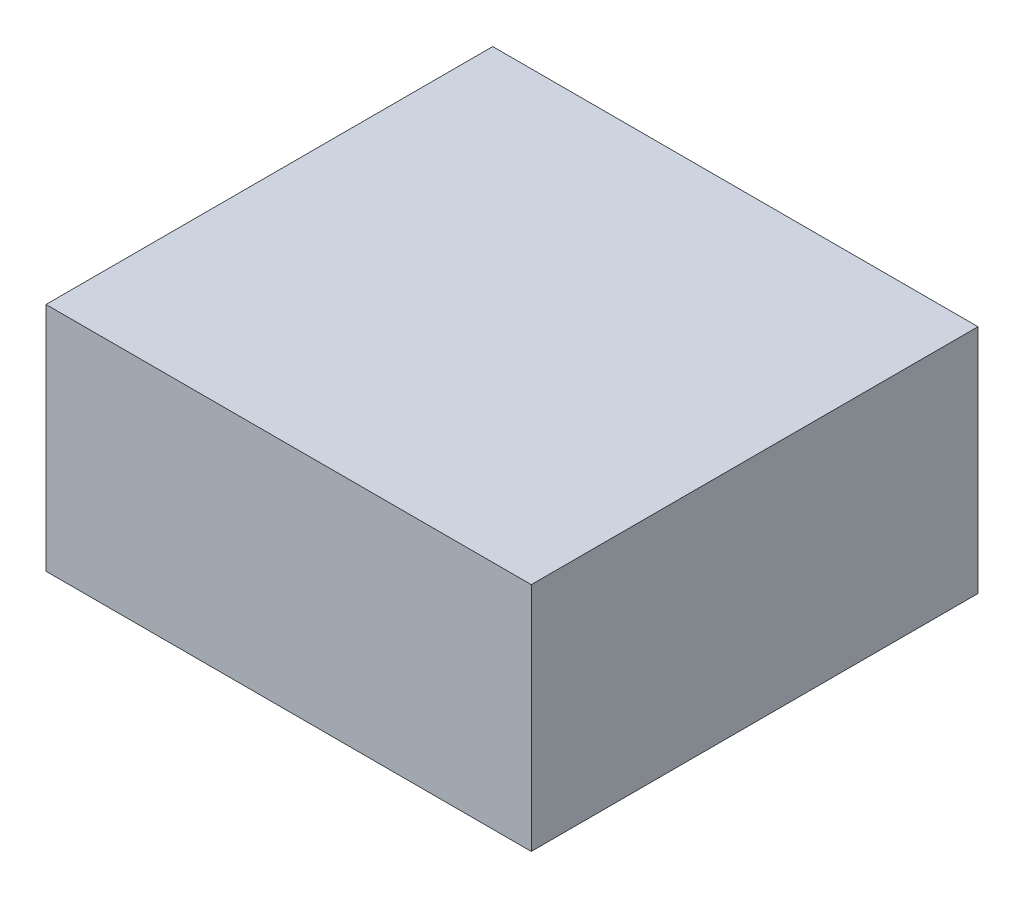
ISO-10303-21;
HEADER;
FILE_DESCRIPTION(('STEP AP214'),'2;1');
FILE_NAME('part.step','',(''),(''),'','','');
FILE_SCHEMA(('AUTOMOTIVE_DESIGN { 1 0 10303 214 1 1 1 1 }'));
ENDSEC;
DATA;
#1=APPLICATION_CONTEXT('core data for automotive mechanical design processes');
#2=APPLICATION_PROTOCOL_DEFINITION('international standard','automotive_design',2000,#1);
#3=PRODUCT_CONTEXT('',#1,'mechanical');
#4=PRODUCT('Part','Part','',(#3));
#5=PRODUCT_RELATED_PRODUCT_CATEGORY('part','',(#4));
#6=PRODUCT_DEFINITION_FORMATION('','',#4);
#7=PRODUCT_DEFINITION_CONTEXT('part definition',#1,'design');
#8=PRODUCT_DEFINITION('design','',#6,#7);
#9=PRODUCT_DEFINITION_SHAPE('','',#8);
#10=(LENGTH_UNIT() NAMED_UNIT(*) SI_UNIT(.MILLI.,.METRE.));
#11=(NAMED_UNIT(*) PLANE_ANGLE_UNIT() SI_UNIT($,.RADIAN.));
#12=(NAMED_UNIT(*) SI_UNIT($,.STERADIAN.) SOLID_ANGLE_UNIT());
#13=UNCERTAINTY_MEASURE_WITH_UNIT(LENGTH_MEASURE(1.E-05),#10,'distance_accuracy_value','');
#14=(GEOMETRIC_REPRESENTATION_CONTEXT(3) GLOBAL_UNCERTAINTY_ASSIGNED_CONTEXT((#13)) GLOBAL_UNIT_ASSIGNED_CONTEXT((#10,
#11,#12)) REPRESENTATION_CONTEXT('',''));
#15=CARTESIAN_POINT('',(0.,0.,0.));
#16=DIRECTION('',(0.,0.,1.));
#17=DIRECTION('',(1.,0.,0.));
#18=AXIS2_PLACEMENT_3D('',#15,#16,#17);
#19=CARTESIAN_POINT('',(0.,30.,0.));
#20=DIRECTION('',(1.,0.,0.));
#21=DIRECTION('',(0.,0.,-1.));
#22=AXIS2_PLACEMENT_3D('',#19,#20,#21);
#23=PLANE('',#22);
#24=DIRECTION('',(0.,0.,1.));
#25=VECTOR('',#24,1.);
#26=CARTESIAN_POINT('',(0.,0.,0.));
#27=LINE('',#26,#25);
#28=CARTESIAN_POINT('',(0.,0.,0.));
#29=VERTEX_POINT('',#28);
#30=CARTESIAN_POINT('',(0.,0.,58.));
#31=VERTEX_POINT('',#30);
#32=EDGE_CURVE('E102',#29,#31,#27,.T.);
#33=ORIENTED_EDGE('',*,*,#32,.T.);
#34=DIRECTION('',(0.,-1.,0.));
#35=VECTOR('',#34,1.);
#36=CARTESIAN_POINT('',(0.,30.,58.));
#37=LINE('',#36,#35);
#38=CARTESIAN_POINT('',(0.,30.,58.));
#39=VERTEX_POINT('',#38);
#40=EDGE_CURVE('E11',#39,#31,#37,.T.);
#41=ORIENTED_EDGE('',*,*,#40,.F.);
#42=DIRECTION('',(0.,0.,1.));
#43=VECTOR('',#42,1.);
#44=CARTESIAN_POINT('',(0.,30.,0.));
#45=LINE('',#44,#43);
#46=CARTESIAN_POINT('',(0.,30.,0.));
#47=VERTEX_POINT('',#46);
#48=EDGE_CURVE('E90',#47,#39,#45,.T.);
#49=ORIENTED_EDGE('',*,*,#48,.F.);
#50=DIRECTION('',(0.,-1.,0.));
#51=VECTOR('',#50,1.);
#52=CARTESIAN_POINT('',(0.,30.,0.));
#53=LINE('',#52,#51);
#54=EDGE_CURVE('E98',#47,#29,#53,.T.);
#55=ORIENTED_EDGE('',*,*,#54,.T.);
#56=EDGE_LOOP('',(#33,#41,#49,#55));
#57=FACE_BOUND('',#56,.T.);
#58=ADVANCED_FACE('F39',(#57),#23,.F.);
#59=CARTESIAN_POINT('',(0.,30.,58.));
#60=DIRECTION('',(0.,0.,-1.));
#61=DIRECTION('',(-1.,0.,0.));
#62=AXIS2_PLACEMENT_3D('',#59,#60,#61);
#63=PLANE('',#62);
#64=DIRECTION('',(1.,0.,0.));
#65=VECTOR('',#64,1.);
#66=CARTESIAN_POINT('',(0.,0.,58.));
#67=LINE('',#66,#65);
#68=CARTESIAN_POINT('',(63.,0.,58.));
#69=VERTEX_POINT('',#68);
#70=EDGE_CURVE('E94',#31,#69,#67,.T.);
#71=ORIENTED_EDGE('',*,*,#70,.T.);
#72=DIRECTION('',(0.,-1.,0.));
#73=VECTOR('',#72,1.);
#74=CARTESIAN_POINT('',(63.,30.,58.));
#75=LINE('',#74,#73);
#76=CARTESIAN_POINT('',(63.,30.,58.));
#77=VERTEX_POINT('',#76);
#78=EDGE_CURVE('E47',#77,#69,#75,.T.);
#79=ORIENTED_EDGE('',*,*,#78,.F.);
#80=DIRECTION('',(1.,0.,0.));
#81=VECTOR('',#80,1.);
#82=CARTESIAN_POINT('',(0.,30.,58.));
#83=LINE('',#82,#81);
#84=EDGE_CURVE('E85',#39,#77,#83,.T.);
#85=ORIENTED_EDGE('',*,*,#84,.F.);
#86=ORIENTED_EDGE('',*,*,#40,.T.);
#87=EDGE_LOOP('',(#71,#79,#85,#86));
#88=FACE_BOUND('',#87,.T.);
#89=ADVANCED_FACE('F93',(#88),#63,.F.);
#90=CARTESIAN_POINT('',(63.,30.,0.));
#91=DIRECTION('',(-1.,0.,0.));
#92=DIRECTION('',(0.,0.,1.));
#93=AXIS2_PLACEMENT_3D('',#90,#91,#92);
#94=PLANE('',#93);
#95=DIRECTION('',(0.,0.,-1.));
#96=VECTOR('',#95,1.);
#97=CARTESIAN_POINT('',(63.,0.,0.));
#98=LINE('',#97,#96);
#99=CARTESIAN_POINT('',(63.,0.,0.));
#100=VERTEX_POINT('',#99);
#101=EDGE_CURVE('E72',#69,#100,#98,.T.);
#102=ORIENTED_EDGE('',*,*,#101,.T.);
#103=DIRECTION('',(0.,-1.,0.));
#104=VECTOR('',#103,1.);
#105=CARTESIAN_POINT('',(63.,30.,0.));
#106=LINE('',#105,#104);
#107=CARTESIAN_POINT('',(63.,30.,0.));
#108=VERTEX_POINT('',#107);
#109=EDGE_CURVE('E95',#108,#100,#106,.T.);
#110=ORIENTED_EDGE('',*,*,#109,.F.);
#111=DIRECTION('',(0.,0.,-1.));
#112=VECTOR('',#111,1.);
#113=CARTESIAN_POINT('',(63.,30.,0.));
#114=LINE('',#113,#112);
#115=EDGE_CURVE('E88',#77,#108,#114,.T.);
#116=ORIENTED_EDGE('',*,*,#115,.F.);
#117=ORIENTED_EDGE('',*,*,#78,.T.);
#118=EDGE_LOOP('',(#102,#110,#116,#117));
#119=FACE_BOUND('',#118,.T.);
#120=ADVANCED_FACE('F96',(#119),#94,.F.);
#121=CARTESIAN_POINT('',(0.,30.,0.));
#122=DIRECTION('',(0.,0.,1.));
#123=DIRECTION('',(1.,0.,0.));
#124=AXIS2_PLACEMENT_3D('',#121,#122,#123);
#125=PLANE('',#124);
#126=DIRECTION('',(-1.,0.,0.));
#127=VECTOR('',#126,1.);
#128=CARTESIAN_POINT('',(0.,0.,0.));
#129=LINE('',#128,#127);
#130=EDGE_CURVE('E78',#100,#29,#129,.T.);
#131=ORIENTED_EDGE('',*,*,#130,.T.);
#132=ORIENTED_EDGE('',*,*,#54,.F.);
#133=DIRECTION('',(-1.,0.,0.));
#134=VECTOR('',#133,1.);
#135=CARTESIAN_POINT('',(0.,30.,0.));
#136=LINE('',#135,#134);
#137=EDGE_CURVE('E55',#108,#47,#136,.T.);
#138=ORIENTED_EDGE('',*,*,#137,.F.);
#139=ORIENTED_EDGE('',*,*,#109,.T.);
#140=EDGE_LOOP('',(#131,#132,#138,#139));
#141=FACE_BOUND('',#140,.T.);
#142=ADVANCED_FACE('F109',(#141),#125,.F.);
#143=CARTESIAN_POINT('',(0.,30.,0.));
#144=DIRECTION('',(0.,1.,0.));
#145=DIRECTION('',(0.,0.,1.));
#146=AXIS2_PLACEMENT_3D('',#143,#144,#145);
#147=PLANE('',#146);
#148=ORIENTED_EDGE('',*,*,#48,.T.);
#149=ORIENTED_EDGE('',*,*,#84,.T.);
#150=ORIENTED_EDGE('',*,*,#115,.T.);
#151=ORIENTED_EDGE('',*,*,#137,.T.);
#152=EDGE_LOOP('',(#148,#149,#150,#151));
#153=FACE_BOUND('',#152,.T.);
#154=ADVANCED_FACE('F86',(#153),#147,.T.);
#155=CARTESIAN_POINT('',(0.,0.,0.));
#156=DIRECTION('',(0.,1.,0.));
#157=DIRECTION('',(0.,0.,1.));
#158=AXIS2_PLACEMENT_3D('',#155,#156,#157);
#159=PLANE('',#158);
#160=ORIENTED_EDGE('',*,*,#32,.F.);
#161=ORIENTED_EDGE('',*,*,#130,.F.);
#162=ORIENTED_EDGE('',*,*,#101,.F.);
#163=ORIENTED_EDGE('',*,*,#70,.F.);
#164=EDGE_LOOP('',(#160,#161,#162,#163));
#165=FACE_BOUND('',#164,.T.);
#166=ADVANCED_FACE('F112',(#165),#159,.F.);
#167=CLOSED_SHELL('',(#58,#89,#120,#142,#154,#166));
#168=MANIFOLD_SOLID_BREP('B2',#167);
#169=ADVANCED_BREP_SHAPE_REPRESENTATION('',(#18,#168),#14);
#170=SHAPE_DEFINITION_REPRESENTATION(#9,#169);
ENDSEC;
END-ISO-10303-21;
